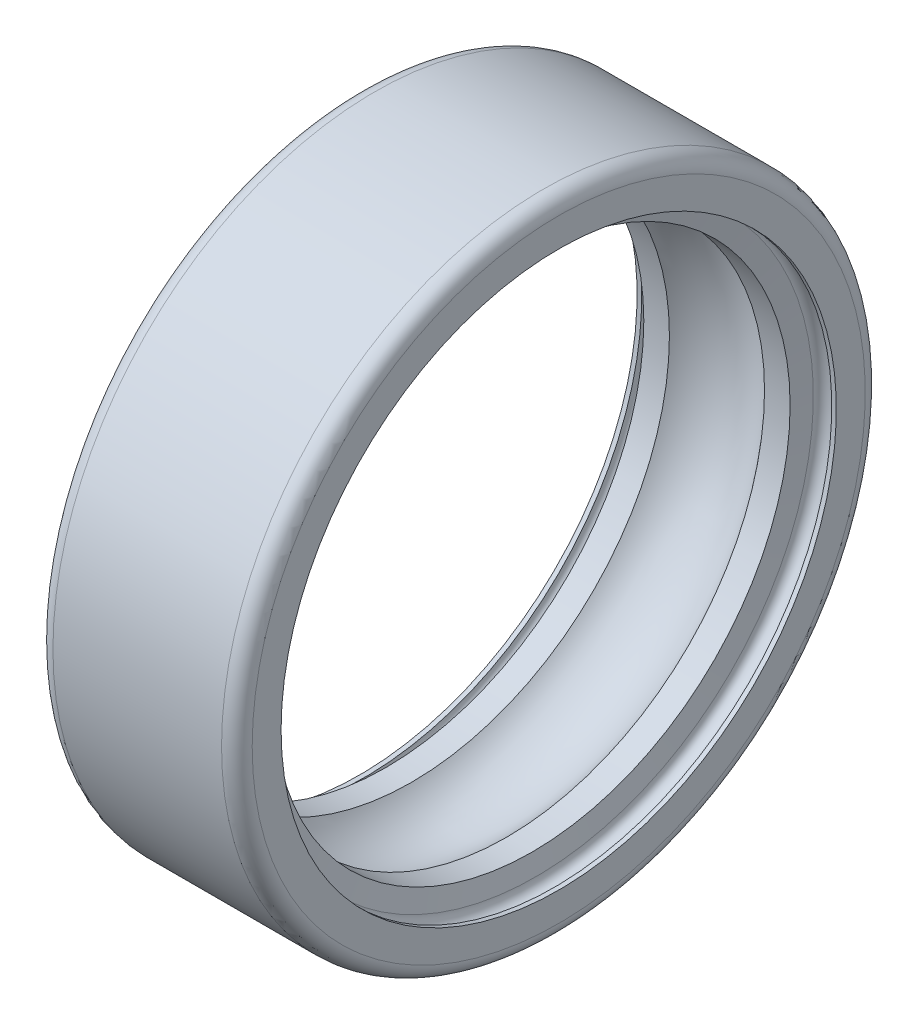
ISO-10303-21;
HEADER;
FILE_DESCRIPTION(('STEP AP214'),'2;1');
FILE_NAME('part.step','',(''),(''),'','','');
FILE_SCHEMA(('AUTOMOTIVE_DESIGN { 1 0 10303 214 1 1 1 1 }'));
ENDSEC;
DATA;
#1=APPLICATION_CONTEXT('core data for automotive mechanical design processes');
#2=APPLICATION_PROTOCOL_DEFINITION('international standard','automotive_design',2000,#1);
#3=PRODUCT_CONTEXT('',#1,'mechanical');
#4=PRODUCT('Part','Part','',(#3));
#5=PRODUCT_RELATED_PRODUCT_CATEGORY('part','',(#4));
#6=PRODUCT_DEFINITION_FORMATION('','',#4);
#7=PRODUCT_DEFINITION_CONTEXT('part definition',#1,'design');
#8=PRODUCT_DEFINITION('design','',#6,#7);
#9=PRODUCT_DEFINITION_SHAPE('','',#8);
#10=(LENGTH_UNIT() NAMED_UNIT(*) SI_UNIT(.MILLI.,.METRE.));
#11=(NAMED_UNIT(*) PLANE_ANGLE_UNIT() SI_UNIT($,.RADIAN.));
#12=(NAMED_UNIT(*) SI_UNIT($,.STERADIAN.) SOLID_ANGLE_UNIT());
#13=UNCERTAINTY_MEASURE_WITH_UNIT(LENGTH_MEASURE(1.E-05),#10,'distance_accuracy_value','');
#14=(GEOMETRIC_REPRESENTATION_CONTEXT(3) GLOBAL_UNCERTAINTY_ASSIGNED_CONTEXT((#13)) GLOBAL_UNIT_ASSIGNED_CONTEXT((#10,
#11,#12)) REPRESENTATION_CONTEXT('',''));
#15=CARTESIAN_POINT('',(0.,0.,0.));
#16=DIRECTION('',(0.,0.,1.));
#17=DIRECTION('',(1.,0.,0.));
#18=AXIS2_PLACEMENT_3D('',#15,#16,#17);
#19=CARTESIAN_POINT('',(0.,19.9999999999992,0.));
#20=DIRECTION('',(1.,0.,0.));
#21=DIRECTION('',(0.,0.,-1.));
#22=AXIS2_PLACEMENT_3D('',#19,#20,#21);
#23=PLANE('',#22);
#24=CARTESIAN_POINT('',(0.,0.,0.));
#25=DIRECTION('',(-1.,0.,0.));
#26=DIRECTION('',(0.,0.,1.));
#27=AXIS2_PLACEMENT_3D('',#24,#25,#26);
#28=CIRCLE('',#27,18.115);
#29=CARTESIAN_POINT('',(0.,0.,18.115));
#30=VERTEX_POINT('',#29);
#31=EDGE_CURVE('E10',#30,#30,#28,.T.);
#32=ORIENTED_EDGE('',*,*,#31,.F.);
#33=EDGE_LOOP('',(#32));
#34=FACE_BOUND('',#33,.T.);
#35=CARTESIAN_POINT('',(0.,0.,0.));
#36=DIRECTION('',(-1.,0.,0.));
#37=DIRECTION('',(0.,0.,1.));
#38=AXIS2_PLACEMENT_3D('',#35,#36,#37);
#39=CIRCLE('',#38,19.9999999999992);
#40=CARTESIAN_POINT('',(0.,0.,19.9999999999992));
#41=VERTEX_POINT('',#40);
#42=EDGE_CURVE('E81',#41,#41,#39,.T.);
#43=ORIENTED_EDGE('',*,*,#42,.T.);
#44=EDGE_LOOP('',(#43));
#45=FACE_BOUND('',#44,.T.);
#46=ADVANCED_FACE('F35',(#34,#45),#23,.F.);
#47=CARTESIAN_POINT('',(50.,0.,0.));
#48=DIRECTION('',(-1.,0.,0.));
#49=DIRECTION('',(0.,0.,1.));
#50=AXIS2_PLACEMENT_3D('',#47,#48,#49);
#51=CYLINDRICAL_SURFACE('',#50,18.115);
#52=CARTESIAN_POINT('',(0.300000000000002,0.,0.));
#53=DIRECTION('',(-1.,0.,0.));
#54=DIRECTION('',(0.,0.,1.));
#55=AXIS2_PLACEMENT_3D('',#52,#53,#54);
#56=CIRCLE('',#55,18.115);
#57=CARTESIAN_POINT('',(0.300000000000002,0.,18.115));
#58=VERTEX_POINT('',#57);
#59=EDGE_CURVE('E41',#58,#58,#56,.T.);
#60=ORIENTED_EDGE('',*,*,#59,.F.);
#61=EDGE_LOOP('',(#60));
#62=FACE_BOUND('',#61,.T.);
#63=ORIENTED_EDGE('',*,*,#31,.T.);
#64=EDGE_LOOP('',(#63));
#65=FACE_BOUND('',#64,.T.);
#66=ADVANCED_FACE('F154',(#62,#65),#51,.F.);
#67=CARTESIAN_POINT('',(0.9,0.,0.));
#68=DIRECTION('',(-1.,0.,0.));
#69=DIRECTION('',(0.,0.,1.));
#70=AXIS2_PLACEMENT_3D('',#67,#68,#69);
#71=TOROIDAL_SURFACE('',#70,18.115,0.6);
#72=CARTESIAN_POINT('',(1.5,0.,0.));
#73=DIRECTION('',(-1.,0.,0.));
#74=DIRECTION('',(0.,0.,1.));
#75=AXIS2_PLACEMENT_3D('',#72,#73,#74);
#76=CIRCLE('',#75,18.115);
#77=CARTESIAN_POINT('',(1.5,0.,18.115));
#78=VERTEX_POINT('',#77);
#79=EDGE_CURVE('E45',#78,#78,#76,.T.);
#80=ORIENTED_EDGE('',*,*,#79,.F.);
#81=EDGE_LOOP('',(#80));
#82=FACE_BOUND('',#81,.T.);
#83=ORIENTED_EDGE('',*,*,#59,.T.);
#84=EDGE_LOOP('',(#83));
#85=FACE_BOUND('',#84,.T.);
#86=ADVANCED_FACE('F149',(#82,#85),#71,.F.);
#87=CARTESIAN_POINT('',(1.5,0.,0.));
#88=DIRECTION('',(-1.,0.,0.));
#89=DIRECTION('',(0.,0.,1.));
#90=AXIS2_PLACEMENT_3D('',#87,#88,#89);
#91=CONICAL_SURFACE('',#90,18.115,1.39626340159548);
#92=CARTESIAN_POINT('',(1.7274618051139,0.,0.));
#93=DIRECTION('',(-1.,0.,0.));
#94=DIRECTION('',(0.,0.,1.));
#95=AXIS2_PLACEMENT_3D('',#92,#93,#94);
#96=CIRCLE('',#95,16.825);
#97=CARTESIAN_POINT('',(1.7274618051139,0.,16.825));
#98=VERTEX_POINT('',#97);
#99=EDGE_CURVE('E49',#98,#98,#96,.T.);
#100=ORIENTED_EDGE('',*,*,#99,.F.);
#101=EDGE_LOOP('',(#100));
#102=FACE_BOUND('',#101,.T.);
#103=ORIENTED_EDGE('',*,*,#79,.T.);
#104=EDGE_LOOP('',(#103));
#105=FACE_BOUND('',#104,.T.);
#106=ADVANCED_FACE('F143',(#102,#105),#91,.F.);
#107=CARTESIAN_POINT('',(50.,0.,0.));
#108=DIRECTION('',(-1.,0.,0.));
#109=DIRECTION('',(0.,0.,1.));
#110=AXIS2_PLACEMENT_3D('',#107,#108,#109);
#111=CYLINDRICAL_SURFACE('',#110,16.825);
#112=CARTESIAN_POINT('',(3.3972051308538,0.,0.));
#113=DIRECTION('',(-1.,0.,0.));
#114=DIRECTION('',(0.,0.,1.));
#115=AXIS2_PLACEMENT_3D('',#112,#113,#114);
#116=CIRCLE('',#115,16.825);
#117=CARTESIAN_POINT('',(3.3972051308538,0.,16.825));
#118=VERTEX_POINT('',#117);
#119=EDGE_CURVE('E54',#118,#118,#116,.T.);
#120=ORIENTED_EDGE('',*,*,#119,.F.);
#121=EDGE_LOOP('',(#120));
#122=FACE_BOUND('',#121,.T.);
#123=ORIENTED_EDGE('',*,*,#99,.T.);
#124=EDGE_LOOP('',(#123));
#125=FACE_BOUND('',#124,.T.);
#126=ADVANCED_FACE('F137',(#122,#125),#111,.F.);
#127=CARTESIAN_POINT('',(6.5,0.,0.));
#128=DIRECTION('',(-1.,0.,0.));
#129=DIRECTION('',(0.,0.,1.));
#130=AXIS2_PLACEMENT_3D('',#127,#128,#129);
#131=TOROIDAL_SURFACE('',#130,14.35,3.969);
#132=CARTESIAN_POINT('',(9.6027948691462,0.,0.));
#133=DIRECTION('',(-1.,0.,0.));
#134=DIRECTION('',(0.,0.,1.));
#135=AXIS2_PLACEMENT_3D('',#132,#133,#134);
#136=CIRCLE('',#135,16.825);
#137=CARTESIAN_POINT('',(9.6027948691462,0.,16.825));
#138=VERTEX_POINT('',#137);
#139=EDGE_CURVE('E57',#138,#138,#136,.T.);
#140=ORIENTED_EDGE('',*,*,#139,.F.);
#141=EDGE_LOOP('',(#140));
#142=FACE_BOUND('',#141,.T.);
#143=ORIENTED_EDGE('',*,*,#119,.T.);
#144=EDGE_LOOP('',(#143));
#145=FACE_BOUND('',#144,.T.);
#146=ADVANCED_FACE('F131',(#142,#145),#131,.F.);
#147=CARTESIAN_POINT('',(50.,0.,0.));
#148=DIRECTION('',(-1.,0.,0.));
#149=DIRECTION('',(0.,0.,1.));
#150=AXIS2_PLACEMENT_3D('',#147,#148,#149);
#151=CYLINDRICAL_SURFACE('',#150,16.825);
#152=CARTESIAN_POINT('',(11.272538194886,0.,0.));
#153=DIRECTION('',(-1.,0.,0.));
#154=DIRECTION('',(0.,0.,1.));
#155=AXIS2_PLACEMENT_3D('',#152,#153,#154);
#156=CIRCLE('',#155,16.825);
#157=CARTESIAN_POINT('',(11.272538194886,0.,16.825));
#158=VERTEX_POINT('',#157);
#159=EDGE_CURVE('E60',#158,#158,#156,.T.);
#160=ORIENTED_EDGE('',*,*,#159,.F.);
#161=EDGE_LOOP('',(#160));
#162=FACE_BOUND('',#161,.T.);
#163=ORIENTED_EDGE('',*,*,#139,.T.);
#164=EDGE_LOOP('',(#163));
#165=FACE_BOUND('',#164,.T.);
#166=ADVANCED_FACE('F125',(#162,#165),#151,.F.);
#167=CARTESIAN_POINT('',(11.272538194886,0.,0.));
#168=DIRECTION('',(1.,0.,0.));
#169=DIRECTION('',(0.,0.,-1.));
#170=AXIS2_PLACEMENT_3D('',#167,#168,#169);
#171=CONICAL_SURFACE('',#170,16.825,1.3962634015954);
#172=CARTESIAN_POINT('',(11.5,0.,0.));
#173=DIRECTION('',(-1.,0.,0.));
#174=DIRECTION('',(0.,0.,1.));
#175=AXIS2_PLACEMENT_3D('',#172,#173,#174);
#176=CIRCLE('',#175,18.115);
#177=CARTESIAN_POINT('',(11.5,0.,18.115));
#178=VERTEX_POINT('',#177);
#179=EDGE_CURVE('E63',#178,#178,#176,.T.);
#180=ORIENTED_EDGE('',*,*,#179,.F.);
#181=EDGE_LOOP('',(#180));
#182=FACE_BOUND('',#181,.T.);
#183=ORIENTED_EDGE('',*,*,#159,.T.);
#184=EDGE_LOOP('',(#183));
#185=FACE_BOUND('',#184,.T.);
#186=ADVANCED_FACE('F119',(#182,#185),#171,.F.);
#187=CARTESIAN_POINT('',(12.1,0.,0.));
#188=DIRECTION('',(-1.,0.,0.));
#189=DIRECTION('',(0.,0.,1.));
#190=AXIS2_PLACEMENT_3D('',#187,#188,#189);
#191=TOROIDAL_SURFACE('',#190,18.115,0.600000000000001);
#192=CARTESIAN_POINT('',(12.7,0.,0.));
#193=DIRECTION('',(-1.,0.,0.));
#194=DIRECTION('',(0.,0.,1.));
#195=AXIS2_PLACEMENT_3D('',#192,#193,#194);
#196=CIRCLE('',#195,18.115);
#197=CARTESIAN_POINT('',(12.7,0.,18.115));
#198=VERTEX_POINT('',#197);
#199=EDGE_CURVE('E66',#198,#198,#196,.T.);
#200=ORIENTED_EDGE('',*,*,#199,.F.);
#201=EDGE_LOOP('',(#200));
#202=FACE_BOUND('',#201,.T.);
#203=ORIENTED_EDGE('',*,*,#179,.T.);
#204=EDGE_LOOP('',(#203));
#205=FACE_BOUND('',#204,.T.);
#206=ADVANCED_FACE('F113',(#202,#205),#191,.F.);
#207=CARTESIAN_POINT('',(50.,0.,0.));
#208=DIRECTION('',(-1.,0.,0.));
#209=DIRECTION('',(0.,0.,1.));
#210=AXIS2_PLACEMENT_3D('',#207,#208,#209);
#211=CYLINDRICAL_SURFACE('',#210,18.115);
#212=CARTESIAN_POINT('',(13.,0.,0.));
#213=DIRECTION('',(-1.,0.,0.));
#214=DIRECTION('',(0.,0.,1.));
#215=AXIS2_PLACEMENT_3D('',#212,#213,#214);
#216=CIRCLE('',#215,18.115);
#217=CARTESIAN_POINT('',(13.,0.,18.115));
#218=VERTEX_POINT('',#217);
#219=EDGE_CURVE('E69',#218,#218,#216,.T.);
#220=ORIENTED_EDGE('',*,*,#219,.F.);
#221=EDGE_LOOP('',(#220));
#222=FACE_BOUND('',#221,.T.);
#223=ORIENTED_EDGE('',*,*,#199,.T.);
#224=EDGE_LOOP('',(#223));
#225=FACE_BOUND('',#224,.T.);
#226=ADVANCED_FACE('F107',(#222,#225),#211,.F.);
#227=CARTESIAN_POINT('',(13.,18.115,0.));
#228=DIRECTION('',(-1.,0.,0.));
#229=DIRECTION('',(0.,0.,1.));
#230=AXIS2_PLACEMENT_3D('',#227,#228,#229);
#231=PLANE('',#230);
#232=CARTESIAN_POINT('',(13.,0.,0.));
#233=DIRECTION('',(-1.,0.,0.));
#234=DIRECTION('',(0.,0.,1.));
#235=AXIS2_PLACEMENT_3D('',#232,#233,#234);
#236=CIRCLE('',#235,20.);
#237=CARTESIAN_POINT('',(13.,0.,20.));
#238=VERTEX_POINT('',#237);
#239=EDGE_CURVE('E72',#238,#238,#236,.T.);
#240=ORIENTED_EDGE('',*,*,#239,.F.);
#241=EDGE_LOOP('',(#240));
#242=FACE_BOUND('',#241,.T.);
#243=ORIENTED_EDGE('',*,*,#219,.T.);
#244=EDGE_LOOP('',(#243));
#245=FACE_BOUND('',#244,.T.);
#246=ADVANCED_FACE('F101',(#242,#245),#231,.F.);
#247=CARTESIAN_POINT('',(12.0000000000016,0.,0.));
#248=DIRECTION('',(-1.,0.,0.));
#249=DIRECTION('',(0.,0.,1.));
#250=AXIS2_PLACEMENT_3D('',#247,#248,#249);
#251=TOROIDAL_SURFACE('',#250,20.0000000000016,0.99999999999845);
#252=CARTESIAN_POINT('',(12.,0.,0.));
#253=DIRECTION('',(-1.,0.,0.));
#254=DIRECTION('',(0.,0.,1.));
#255=AXIS2_PLACEMENT_3D('',#252,#253,#254);
#256=CIRCLE('',#255,21.);
#257=CARTESIAN_POINT('',(12.,0.,21.));
#258=VERTEX_POINT('',#257);
#259=EDGE_CURVE('E75',#258,#258,#256,.T.);
#260=ORIENTED_EDGE('',*,*,#259,.F.);
#261=EDGE_LOOP('',(#260));
#262=FACE_BOUND('',#261,.T.);
#263=ORIENTED_EDGE('',*,*,#239,.T.);
#264=EDGE_LOOP('',(#263));
#265=FACE_BOUND('',#264,.T.);
#266=ADVANCED_FACE('F95',(#262,#265),#251,.T.);
#267=CARTESIAN_POINT('',(50.,0.,0.));
#268=DIRECTION('',(-1.,0.,0.));
#269=DIRECTION('',(0.,0.,1.));
#270=AXIS2_PLACEMENT_3D('',#267,#268,#269);
#271=CYLINDRICAL_SURFACE('',#270,21.);
#272=CARTESIAN_POINT('',(1.,0.,0.));
#273=DIRECTION('',(-1.,0.,0.));
#274=DIRECTION('',(0.,0.,1.));
#275=AXIS2_PLACEMENT_3D('',#272,#273,#274);
#276=CIRCLE('',#275,21.);
#277=CARTESIAN_POINT('',(1.,0.,21.));
#278=VERTEX_POINT('',#277);
#279=EDGE_CURVE('E78',#278,#278,#276,.T.);
#280=ORIENTED_EDGE('',*,*,#279,.F.);
#281=EDGE_LOOP('',(#280));
#282=FACE_BOUND('',#281,.T.);
#283=ORIENTED_EDGE('',*,*,#259,.T.);
#284=EDGE_LOOP('',(#283));
#285=FACE_BOUND('',#284,.T.);
#286=ADVANCED_FACE('F89',(#282,#285),#271,.T.);
#287=CARTESIAN_POINT('',(0.999999999999218,0.,0.));
#288=DIRECTION('',(-1.,0.,0.));
#289=DIRECTION('',(0.,0.,1.));
#290=AXIS2_PLACEMENT_3D('',#287,#288,#289);
#291=TOROIDAL_SURFACE('',#290,20.0000000000008,0.999999999999214);
#292=ORIENTED_EDGE('',*,*,#42,.F.);
#293=EDGE_LOOP('',(#292));
#294=FACE_BOUND('',#293,.T.);
#295=ORIENTED_EDGE('',*,*,#279,.T.);
#296=EDGE_LOOP('',(#295));
#297=FACE_BOUND('',#296,.T.);
#298=ADVANCED_FACE('F86',(#294,#297),#291,.T.);
#299=CLOSED_SHELL('',(#46,#66,#86,#106,#126,#146,#166,#186,#206,#226,#246,#266,#286,#298));
#300=MANIFOLD_SOLID_BREP('B2',#299);
#301=ADVANCED_BREP_SHAPE_REPRESENTATION('',(#18,#300),#14);
#302=SHAPE_DEFINITION_REPRESENTATION(#9,#301);
ENDSEC;
END-ISO-10303-21;
